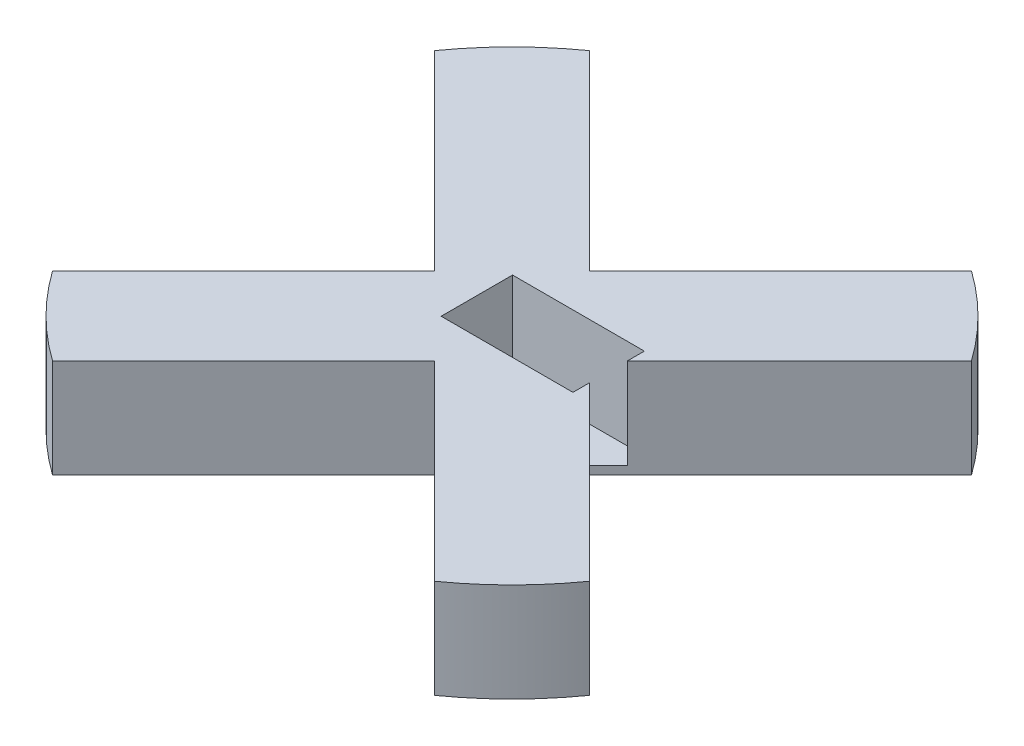
ISO-10303-21;
HEADER;
FILE_DESCRIPTION(('STEP AP214'),'2;1');
FILE_NAME('part.step','',(''),(''),'','','');
FILE_SCHEMA(('AUTOMOTIVE_DESIGN { 1 0 10303 214 1 1 1 1 }'));
ENDSEC;
DATA;
#1=APPLICATION_CONTEXT('core data for automotive mechanical design processes');
#2=APPLICATION_PROTOCOL_DEFINITION('international standard','automotive_design',2000,#1);
#3=PRODUCT_CONTEXT('',#1,'mechanical');
#4=PRODUCT('Part','Part','',(#3));
#5=PRODUCT_RELATED_PRODUCT_CATEGORY('part','',(#4));
#6=PRODUCT_DEFINITION_FORMATION('','',#4);
#7=PRODUCT_DEFINITION_CONTEXT('part definition',#1,'design');
#8=PRODUCT_DEFINITION('design','',#6,#7);
#9=PRODUCT_DEFINITION_SHAPE('','',#8);
#10=(LENGTH_UNIT() NAMED_UNIT(*) SI_UNIT(.MILLI.,.METRE.));
#11=(NAMED_UNIT(*) PLANE_ANGLE_UNIT() SI_UNIT($,.RADIAN.));
#12=(NAMED_UNIT(*) SI_UNIT($,.STERADIAN.) SOLID_ANGLE_UNIT());
#13=UNCERTAINTY_MEASURE_WITH_UNIT(LENGTH_MEASURE(1.E-05),#10,'distance_accuracy_value','');
#14=(GEOMETRIC_REPRESENTATION_CONTEXT(3) GLOBAL_UNCERTAINTY_ASSIGNED_CONTEXT((#13)) GLOBAL_UNIT_ASSIGNED_CONTEXT((#10,
#11,#12)) REPRESENTATION_CONTEXT('',''));
#15=CARTESIAN_POINT('',(0.,0.,0.));
#16=DIRECTION('',(0.,0.,1.));
#17=DIRECTION('',(1.,0.,0.));
#18=AXIS2_PLACEMENT_3D('',#15,#16,#17);
#19=CARTESIAN_POINT('',(0.,18.,0.));
#20=DIRECTION('',(0.,-1.,0.));
#21=DIRECTION('',(0.,0.,-1.));
#22=AXIS2_PLACEMENT_3D('',#19,#20,#21);
#23=CYLINDRICAL_SURFACE('',#22,60.);
#24=CARTESIAN_POINT('',(0.,0.,0.));
#25=DIRECTION('',(0.,1.,0.));
#26=DIRECTION('',(0.,0.,1.));
#27=AXIS2_PLACEMENT_3D('',#24,#25,#26);
#28=CIRCLE('',#27,60.);
#29=CARTESIAN_POINT('',(-34.7619335148383,0.,-48.9040691385692));
#30=VERTEX_POINT('',#29);
#31=CARTESIAN_POINT('',(-48.9040691385692,0.,-34.7619335148383));
#32=VERTEX_POINT('',#31);
#33=EDGE_CURVE('E163',#30,#32,#28,.T.);
#34=ORIENTED_EDGE('',*,*,#33,.T.);
#35=DIRECTION('',(0.,-1.,0.));
#36=VECTOR('',#35,1.);
#37=CARTESIAN_POINT('',(-48.9040691385692,18.,-34.7619335148383));
#38=LINE('',#37,#36);
#39=CARTESIAN_POINT('',(-48.9040691385692,18.,-34.7619335148383));
#40=VERTEX_POINT('',#39);
#41=EDGE_CURVE('E212',#40,#32,#38,.T.);
#42=ORIENTED_EDGE('',*,*,#41,.F.);
#43=CARTESIAN_POINT('',(0.,18.,0.));
#44=DIRECTION('',(0.,1.,0.));
#45=DIRECTION('',(0.,0.,1.));
#46=AXIS2_PLACEMENT_3D('',#43,#44,#45);
#47=CIRCLE('',#46,60.);
#48=CARTESIAN_POINT('',(-34.7619335148383,18.,-48.9040691385692));
#49=VERTEX_POINT('',#48);
#50=EDGE_CURVE('E188',#49,#40,#47,.T.);
#51=ORIENTED_EDGE('',*,*,#50,.F.);
#52=DIRECTION('',(0.,-1.,0.));
#53=VECTOR('',#52,1.);
#54=CARTESIAN_POINT('',(-34.7619335148383,18.,-48.9040691385692));
#55=LINE('',#54,#53);
#56=EDGE_CURVE('E159',#49,#30,#55,.T.);
#57=ORIENTED_EDGE('',*,*,#56,.T.);
#58=EDGE_LOOP('',(#34,#42,#51,#57));
#59=FACE_BOUND('',#58,.T.);
#60=ADVANCED_FACE('F33',(#59),#23,.T.);
#61=CARTESIAN_POINT('',(-14.1421356237309,18.,0.));
#62=DIRECTION('',(0.707106781186548,0.,-0.707106781186547));
#63=DIRECTION('',(-0.707106781186547,0.,-0.707106781186548));
#64=AXIS2_PLACEMENT_3D('',#61,#62,#63);
#65=PLANE('',#64);
#66=DIRECTION('',(0.707106781186547,0.,0.707106781186548));
#67=VECTOR('',#66,1.);
#68=CARTESIAN_POINT('',(-14.1421356237309,0.,0.));
#69=LINE('',#68,#67);
#70=CARTESIAN_POINT('',(-14.1421356237309,0.,0.));
#71=VERTEX_POINT('',#70);
#72=EDGE_CURVE('E166',#32,#71,#69,.T.);
#73=ORIENTED_EDGE('',*,*,#72,.T.);
#74=DIRECTION('',(0.,-1.,0.));
#75=VECTOR('',#74,1.);
#76=CARTESIAN_POINT('',(-14.1421356237309,18.,0.));
#77=LINE('',#76,#75);
#78=CARTESIAN_POINT('',(-14.1421356237309,18.,0.));
#79=VERTEX_POINT('',#78);
#80=EDGE_CURVE('E209',#79,#71,#77,.T.);
#81=ORIENTED_EDGE('',*,*,#80,.F.);
#82=DIRECTION('',(0.707106781186547,0.,0.707106781186548));
#83=VECTOR('',#82,1.);
#84=CARTESIAN_POINT('',(-14.1421356237309,18.,0.));
#85=LINE('',#84,#83);
#86=EDGE_CURVE('E110',#40,#79,#85,.T.);
#87=ORIENTED_EDGE('',*,*,#86,.F.);
#88=ORIENTED_EDGE('',*,*,#41,.T.);
#89=EDGE_LOOP('',(#73,#81,#87,#88));
#90=FACE_BOUND('',#89,.T.);
#91=ADVANCED_FACE('F333',(#90),#65,.F.);
#92=CARTESIAN_POINT('',(-14.1421356237309,18.,0.));
#93=DIRECTION('',(0.707106781186548,0.,0.707106781186547));
#94=DIRECTION('',(0.707106781186547,0.,-0.707106781186548));
#95=AXIS2_PLACEMENT_3D('',#92,#93,#94);
#96=PLANE('',#95);
#97=DIRECTION('',(-0.707106781186547,0.,0.707106781186548));
#98=VECTOR('',#97,1.);
#99=CARTESIAN_POINT('',(-14.1421356237309,0.,0.));
#100=LINE('',#99,#98);
#101=CARTESIAN_POINT('',(-48.9040691385693,0.,34.7619335148383));
#102=VERTEX_POINT('',#101);
#103=EDGE_CURVE('E169',#71,#102,#100,.T.);
#104=ORIENTED_EDGE('',*,*,#103,.T.);
#105=DIRECTION('',(0.,-1.,0.));
#106=VECTOR('',#105,1.);
#107=CARTESIAN_POINT('',(-48.9040691385693,18.,34.7619335148383));
#108=LINE('',#107,#106);
#109=CARTESIAN_POINT('',(-48.9040691385693,18.,34.7619335148383));
#110=VERTEX_POINT('',#109);
#111=EDGE_CURVE('E206',#110,#102,#108,.T.);
#112=ORIENTED_EDGE('',*,*,#111,.F.);
#113=DIRECTION('',(-0.707106781186547,0.,0.707106781186548));
#114=VECTOR('',#113,1.);
#115=CARTESIAN_POINT('',(-14.1421356237309,18.,0.));
#116=LINE('',#115,#114);
#117=EDGE_CURVE('E266',#79,#110,#116,.T.);
#118=ORIENTED_EDGE('',*,*,#117,.F.);
#119=ORIENTED_EDGE('',*,*,#80,.T.);
#120=EDGE_LOOP('',(#104,#112,#118,#119));
#121=FACE_BOUND('',#120,.T.);
#122=ADVANCED_FACE('F336',(#121),#96,.F.);
#123=CARTESIAN_POINT('',(0.,18.,0.));
#124=DIRECTION('',(0.,-1.,0.));
#125=DIRECTION('',(0.,0.,-1.));
#126=AXIS2_PLACEMENT_3D('',#123,#124,#125);
#127=CYLINDRICAL_SURFACE('',#126,60.);
#128=CARTESIAN_POINT('',(0.,0.,0.));
#129=DIRECTION('',(0.,1.,0.));
#130=DIRECTION('',(0.,0.,-1.));
#131=AXIS2_PLACEMENT_3D('',#128,#129,#130);
#132=CIRCLE('',#131,60.);
#133=CARTESIAN_POINT('',(-34.7619335148383,0.,48.9040691385692));
#134=VERTEX_POINT('',#133);
#135=EDGE_CURVE('E171',#102,#134,#132,.T.);
#136=ORIENTED_EDGE('',*,*,#135,.T.);
#137=DIRECTION('',(0.,-1.,0.));
#138=VECTOR('',#137,1.);
#139=CARTESIAN_POINT('',(-34.7619335148383,18.,48.9040691385692));
#140=LINE('',#139,#138);
#141=CARTESIAN_POINT('',(-34.7619335148383,18.,48.9040691385692));
#142=VERTEX_POINT('',#141);
#143=EDGE_CURVE('E203',#142,#134,#140,.T.);
#144=ORIENTED_EDGE('',*,*,#143,.F.);
#145=CARTESIAN_POINT('',(0.,18.,0.));
#146=DIRECTION('',(0.,1.,0.));
#147=DIRECTION('',(0.,0.,-1.));
#148=AXIS2_PLACEMENT_3D('',#145,#146,#147);
#149=CIRCLE('',#148,60.);
#150=EDGE_CURVE('E268',#110,#142,#149,.T.);
#151=ORIENTED_EDGE('',*,*,#150,.F.);
#152=ORIENTED_EDGE('',*,*,#111,.T.);
#153=EDGE_LOOP('',(#136,#144,#151,#152));
#154=FACE_BOUND('',#153,.T.);
#155=ADVANCED_FACE('F341',(#154),#127,.T.);
#156=CARTESIAN_POINT('',(0.,18.,14.142135623731));
#157=DIRECTION('',(-0.707106781186548,0.,-0.707106781186548));
#158=DIRECTION('',(-0.707106781186548,0.,0.707106781186547));
#159=AXIS2_PLACEMENT_3D('',#156,#157,#158);
#160=PLANE('',#159);
#161=DIRECTION('',(0.707106781186547,0.,-0.707106781186547));
#162=VECTOR('',#161,1.);
#163=CARTESIAN_POINT('',(0.,0.,14.142135623731));
#164=LINE('',#163,#162);
#165=CARTESIAN_POINT('',(0.,0.,14.142135623731));
#166=VERTEX_POINT('',#165);
#167=EDGE_CURVE('E173',#134,#166,#164,.T.);
#168=ORIENTED_EDGE('',*,*,#167,.T.);
#169=DIRECTION('',(0.,-1.,0.));
#170=VECTOR('',#169,1.);
#171=CARTESIAN_POINT('',(0.,18.,14.142135623731));
#172=LINE('',#171,#170);
#173=CARTESIAN_POINT('',(0.,18.,14.142135623731));
#174=VERTEX_POINT('',#173);
#175=EDGE_CURVE('E200',#174,#166,#172,.T.);
#176=ORIENTED_EDGE('',*,*,#175,.F.);
#177=DIRECTION('',(0.707106781186547,0.,-0.707106781186547));
#178=VECTOR('',#177,1.);
#179=CARTESIAN_POINT('',(0.,18.,14.142135623731));
#180=LINE('',#179,#178);
#181=EDGE_CURVE('E270',#142,#174,#180,.T.);
#182=ORIENTED_EDGE('',*,*,#181,.F.);
#183=ORIENTED_EDGE('',*,*,#143,.T.);
#184=EDGE_LOOP('',(#168,#176,#182,#183));
#185=FACE_BOUND('',#184,.T.);
#186=ADVANCED_FACE('F347',(#185),#160,.F.);
#187=CARTESIAN_POINT('',(0.,18.,14.142135623731));
#188=DIRECTION('',(0.707106781186548,0.,-0.707106781186548));
#189=DIRECTION('',(-0.707106781186548,0.,-0.707106781186547));
#190=AXIS2_PLACEMENT_3D('',#187,#188,#189);
#191=PLANE('',#190);
#192=DIRECTION('',(0.707106781186547,0.,0.707106781186547));
#193=VECTOR('',#192,1.);
#194=CARTESIAN_POINT('',(0.,0.,14.142135623731));
#195=LINE('',#194,#193);
#196=CARTESIAN_POINT('',(34.7619335148383,0.,48.9040691385692));
#197=VERTEX_POINT('',#196);
#198=EDGE_CURVE('E175',#166,#197,#195,.T.);
#199=ORIENTED_EDGE('',*,*,#198,.T.);
#200=DIRECTION('',(0.,-1.,0.));
#201=VECTOR('',#200,1.);
#202=CARTESIAN_POINT('',(34.7619335148383,18.,48.9040691385692));
#203=LINE('',#202,#201);
#204=CARTESIAN_POINT('',(34.7619335148383,18.,48.9040691385692));
#205=VERTEX_POINT('',#204);
#206=EDGE_CURVE('E197',#205,#197,#203,.T.);
#207=ORIENTED_EDGE('',*,*,#206,.F.);
#208=DIRECTION('',(0.707106781186547,0.,0.707106781186547));
#209=VECTOR('',#208,1.);
#210=CARTESIAN_POINT('',(0.,18.,14.142135623731));
#211=LINE('',#210,#209);
#212=EDGE_CURVE('E272',#174,#205,#211,.T.);
#213=ORIENTED_EDGE('',*,*,#212,.F.);
#214=ORIENTED_EDGE('',*,*,#175,.T.);
#215=EDGE_LOOP('',(#199,#207,#213,#214));
#216=FACE_BOUND('',#215,.T.);
#217=ADVANCED_FACE('F351',(#216),#191,.F.);
#218=CARTESIAN_POINT('',(0.,18.,0.));
#219=DIRECTION('',(0.,-1.,0.));
#220=DIRECTION('',(0.,0.,-1.));
#221=AXIS2_PLACEMENT_3D('',#218,#219,#220);
#222=CYLINDRICAL_SURFACE('',#221,60.);
#223=CARTESIAN_POINT('',(0.,0.,0.));
#224=DIRECTION('',(0.,1.,0.));
#225=DIRECTION('',(0.,0.,1.));
#226=AXIS2_PLACEMENT_3D('',#223,#224,#225);
#227=CIRCLE('',#226,60.);
#228=CARTESIAN_POINT('',(48.9040691385692,0.,34.7619335148383));
#229=VERTEX_POINT('',#228);
#230=EDGE_CURVE('E177',#197,#229,#227,.T.);
#231=ORIENTED_EDGE('',*,*,#230,.T.);
#232=DIRECTION('',(0.,-1.,0.));
#233=VECTOR('',#232,1.);
#234=CARTESIAN_POINT('',(48.9040691385692,18.,34.7619335148383));
#235=LINE('',#234,#233);
#236=CARTESIAN_POINT('',(48.9040691385692,18.,34.7619335148383));
#237=VERTEX_POINT('',#236);
#238=EDGE_CURVE('E194',#237,#229,#235,.T.);
#239=ORIENTED_EDGE('',*,*,#238,.F.);
#240=CARTESIAN_POINT('',(0.,18.,0.));
#241=DIRECTION('',(0.,1.,0.));
#242=DIRECTION('',(0.,0.,1.));
#243=AXIS2_PLACEMENT_3D('',#240,#241,#242);
#244=CIRCLE('',#243,60.);
#245=EDGE_CURVE('E274',#205,#237,#244,.T.);
#246=ORIENTED_EDGE('',*,*,#245,.F.);
#247=ORIENTED_EDGE('',*,*,#206,.T.);
#248=EDGE_LOOP('',(#231,#239,#246,#247));
#249=FACE_BOUND('',#248,.T.);
#250=ADVANCED_FACE('F354',(#249),#222,.T.);
#251=CARTESIAN_POINT('',(14.1421356237309,18.,0.));
#252=DIRECTION('',(-0.707106781186548,0.,0.707106781186547));
#253=DIRECTION('',(0.707106781186547,0.,0.707106781186548));
#254=AXIS2_PLACEMENT_3D('',#251,#252,#253);
#255=PLANE('',#254);
#256=DIRECTION('',(-0.707106781186547,0.,-0.707106781186548));
#257=VECTOR('',#256,1.);
#258=CARTESIAN_POINT('',(14.1421356237309,1.5,0.));
#259=LINE('',#258,#257);
#260=CARTESIAN_POINT('',(17.6,1.5,3.45786437626905));
#261=VERTEX_POINT('',#260);
#262=CARTESIAN_POINT('',(14.1421356237309,1.5,0.));
#263=VERTEX_POINT('',#262);
#264=EDGE_CURVE('E167',#261,#263,#259,.T.);
#265=ORIENTED_EDGE('',*,*,#264,.F.);
#266=DIRECTION('',(0.,1.,0.));
#267=VECTOR('',#266,1.);
#268=CARTESIAN_POINT('',(17.6,18.,3.45786437626905));
#269=LINE('',#268,#267);
#270=CARTESIAN_POINT('',(17.6,18.,3.45786437626905));
#271=VERTEX_POINT('',#270);
#272=EDGE_CURVE('E259',#261,#271,#269,.T.);
#273=ORIENTED_EDGE('',*,*,#272,.T.);
#274=DIRECTION('',(-0.707106781186547,0.,-0.707106781186548));
#275=VECTOR('',#274,1.);
#276=CARTESIAN_POINT('',(14.1421356237309,18.,0.));
#277=LINE('',#276,#275);
#278=EDGE_CURVE('E276',#237,#271,#277,.T.);
#279=ORIENTED_EDGE('',*,*,#278,.F.);
#280=ORIENTED_EDGE('',*,*,#238,.T.);
#281=DIRECTION('',(-0.707106781186547,0.,-0.707106781186548));
#282=VECTOR('',#281,1.);
#283=CARTESIAN_POINT('',(14.1421356237309,0.,0.));
#284=LINE('',#283,#282);
#285=CARTESIAN_POINT('',(14.1421356237309,0.,0.));
#286=VERTEX_POINT('',#285);
#287=EDGE_CURVE('E179',#229,#286,#284,.T.);
#288=ORIENTED_EDGE('',*,*,#287,.T.);
#289=DIRECTION('',(0.,-1.,0.));
#290=VECTOR('',#289,1.);
#291=CARTESIAN_POINT('',(14.1421356237309,18.,0.));
#292=LINE('',#291,#290);
#293=EDGE_CURVE('E192',#263,#286,#292,.T.);
#294=ORIENTED_EDGE('',*,*,#293,.F.);
#295=EDGE_LOOP('',(#265,#273,#279,#280,#288,#294));
#296=FACE_BOUND('',#295,.T.);
#297=ADVANCED_FACE('F287',(#296),#255,.F.);
#298=CARTESIAN_POINT('',(14.1421356237309,18.,0.));
#299=DIRECTION('',(-0.707106781186548,0.,-0.707106781186547));
#300=DIRECTION('',(-0.707106781186547,0.,0.707106781186548));
#301=AXIS2_PLACEMENT_3D('',#298,#299,#300);
#302=PLANE('',#301);
#303=DIRECTION('',(0.707106781186547,0.,-0.707106781186548));
#304=VECTOR('',#303,1.);
#305=CARTESIAN_POINT('',(14.1421356237309,18.,0.));
#306=LINE('',#305,#304);
#307=CARTESIAN_POINT('',(17.6,18.,-3.45786437626905));
#308=VERTEX_POINT('',#307);
#309=CARTESIAN_POINT('',(48.9040691385692,18.,-34.7619335148383));
#310=VERTEX_POINT('',#309);
#311=EDGE_CURVE('E142',#308,#310,#306,.T.);
#312=ORIENTED_EDGE('',*,*,#311,.F.);
#313=DIRECTION('',(0.,-1.,0.));
#314=VECTOR('',#313,1.);
#315=CARTESIAN_POINT('',(17.6,18.,-3.45786437626905));
#316=LINE('',#315,#314);
#317=CARTESIAN_POINT('',(17.6,1.5,-3.45786437626905));
#318=VERTEX_POINT('',#317);
#319=EDGE_CURVE('E226',#308,#318,#316,.T.);
#320=ORIENTED_EDGE('',*,*,#319,.T.);
#321=DIRECTION('',(0.707106781186547,0.,-0.707106781186548));
#322=VECTOR('',#321,1.);
#323=CARTESIAN_POINT('',(14.1421356237309,1.5,0.));
#324=LINE('',#323,#322);
#325=EDGE_CURVE('E11',#263,#318,#324,.T.);
#326=ORIENTED_EDGE('',*,*,#325,.F.);
#327=ORIENTED_EDGE('',*,*,#293,.T.);
#328=DIRECTION('',(0.707106781186547,0.,-0.707106781186548));
#329=VECTOR('',#328,1.);
#330=CARTESIAN_POINT('',(14.1421356237309,0.,0.));
#331=LINE('',#330,#329);
#332=CARTESIAN_POINT('',(48.9040691385692,0.,-34.7619335148383));
#333=VERTEX_POINT('',#332);
#334=EDGE_CURVE('E182',#286,#333,#331,.T.);
#335=ORIENTED_EDGE('',*,*,#334,.T.);
#336=DIRECTION('',(0.,-1.,0.));
#337=VECTOR('',#336,1.);
#338=CARTESIAN_POINT('',(48.9040691385692,18.,-34.7619335148383));
#339=LINE('',#338,#337);
#340=EDGE_CURVE('E154',#310,#333,#339,.T.);
#341=ORIENTED_EDGE('',*,*,#340,.F.);
#342=EDGE_LOOP('',(#312,#320,#326,#327,#335,#341));
#343=FACE_BOUND('',#342,.T.);
#344=ADVANCED_FACE('F322',(#343),#302,.F.);
#345=CARTESIAN_POINT('',(0.,18.,0.));
#346=DIRECTION('',(0.,-1.,0.));
#347=DIRECTION('',(0.,0.,-1.));
#348=AXIS2_PLACEMENT_3D('',#345,#346,#347);
#349=CYLINDRICAL_SURFACE('',#348,60.);
#350=CARTESIAN_POINT('',(0.,0.,0.));
#351=DIRECTION('',(0.,1.,0.));
#352=DIRECTION('',(0.,0.,-1.));
#353=AXIS2_PLACEMENT_3D('',#350,#351,#352);
#354=CIRCLE('',#353,60.);
#355=CARTESIAN_POINT('',(34.7619335148383,0.,-48.9040691385692));
#356=VERTEX_POINT('',#355);
#357=EDGE_CURVE('E151',#333,#356,#354,.T.);
#358=ORIENTED_EDGE('',*,*,#357,.T.);
#359=DIRECTION('',(0.,-1.,0.));
#360=VECTOR('',#359,1.);
#361=CARTESIAN_POINT('',(34.7619335148383,18.,-48.9040691385692));
#362=LINE('',#361,#360);
#363=CARTESIAN_POINT('',(34.7619335148383,18.,-48.9040691385692));
#364=VERTEX_POINT('',#363);
#365=EDGE_CURVE('E148',#364,#356,#362,.T.);
#366=ORIENTED_EDGE('',*,*,#365,.F.);
#367=CARTESIAN_POINT('',(0.,18.,0.));
#368=DIRECTION('',(0.,1.,0.));
#369=DIRECTION('',(0.,0.,-1.));
#370=AXIS2_PLACEMENT_3D('',#367,#368,#369);
#371=CIRCLE('',#370,60.);
#372=EDGE_CURVE('E134',#310,#364,#371,.T.);
#373=ORIENTED_EDGE('',*,*,#372,.F.);
#374=ORIENTED_EDGE('',*,*,#340,.T.);
#375=EDGE_LOOP('',(#358,#366,#373,#374));
#376=FACE_BOUND('',#375,.T.);
#377=ADVANCED_FACE('F149',(#376),#349,.T.);
#378=CARTESIAN_POINT('',(0.,18.,-14.1421356237309));
#379=DIRECTION('',(0.707106781186547,0.,0.707106781186547));
#380=DIRECTION('',(0.707106781186548,0.,-0.707106781186548));
#381=AXIS2_PLACEMENT_3D('',#378,#379,#380);
#382=PLANE('',#381);
#383=DIRECTION('',(-0.707106781186547,0.,0.707106781186547));
#384=VECTOR('',#383,1.);
#385=CARTESIAN_POINT('',(0.,0.,-14.1421356237309));
#386=LINE('',#385,#384);
#387=CARTESIAN_POINT('',(0.,0.,-14.1421356237309));
#388=VERTEX_POINT('',#387);
#389=EDGE_CURVE('E185',#356,#388,#386,.T.);
#390=ORIENTED_EDGE('',*,*,#389,.T.);
#391=DIRECTION('',(0.,-1.,0.));
#392=VECTOR('',#391,1.);
#393=CARTESIAN_POINT('',(0.,18.,-14.1421356237309));
#394=LINE('',#393,#392);
#395=CARTESIAN_POINT('',(0.,18.,-14.1421356237309));
#396=VERTEX_POINT('',#395);
#397=EDGE_CURVE('E155',#396,#388,#394,.T.);
#398=ORIENTED_EDGE('',*,*,#397,.F.);
#399=DIRECTION('',(-0.707106781186547,0.,0.707106781186547));
#400=VECTOR('',#399,1.);
#401=CARTESIAN_POINT('',(0.,18.,-14.1421356237309));
#402=LINE('',#401,#400);
#403=EDGE_CURVE('E139',#364,#396,#402,.T.);
#404=ORIENTED_EDGE('',*,*,#403,.F.);
#405=ORIENTED_EDGE('',*,*,#365,.T.);
#406=EDGE_LOOP('',(#390,#398,#404,#405));
#407=FACE_BOUND('',#406,.T.);
#408=ADVANCED_FACE('F157',(#407),#382,.F.);
#409=CARTESIAN_POINT('',(0.,18.,-14.1421356237309));
#410=DIRECTION('',(-0.707106781186547,0.,0.707106781186547));
#411=DIRECTION('',(0.707106781186548,0.,0.707106781186548));
#412=AXIS2_PLACEMENT_3D('',#409,#410,#411);
#413=PLANE('',#412);
#414=DIRECTION('',(-0.707106781186547,0.,-0.707106781186547));
#415=VECTOR('',#414,1.);
#416=CARTESIAN_POINT('',(0.,0.,-14.1421356237309));
#417=LINE('',#416,#415);
#418=EDGE_CURVE('E101',#388,#30,#417,.T.);
#419=ORIENTED_EDGE('',*,*,#418,.T.);
#420=ORIENTED_EDGE('',*,*,#56,.F.);
#421=DIRECTION('',(-0.707106781186547,0.,-0.707106781186547));
#422=VECTOR('',#421,1.);
#423=CARTESIAN_POINT('',(0.,18.,-14.1421356237309));
#424=LINE('',#423,#422);
#425=EDGE_CURVE('E56',#396,#49,#424,.T.);
#426=ORIENTED_EDGE('',*,*,#425,.F.);
#427=ORIENTED_EDGE('',*,*,#397,.T.);
#428=EDGE_LOOP('',(#419,#420,#426,#427));
#429=FACE_BOUND('',#428,.T.);
#430=ADVANCED_FACE('F327',(#429),#413,.F.);
#431=CARTESIAN_POINT('',(0.,18.,0.));
#432=DIRECTION('',(0.,1.,0.));
#433=DIRECTION('',(0.,0.,1.));
#434=AXIS2_PLACEMENT_3D('',#431,#432,#433);
#435=PLANE('',#434);
#436=DIRECTION('',(0.,0.,-1.));
#437=VECTOR('',#436,1.);
#438=CARTESIAN_POINT('',(17.6,18.,0.));
#439=LINE('',#438,#437);
#440=CARTESIAN_POINT('',(17.6,18.,-6.5));
#441=VERTEX_POINT('',#440);
#442=EDGE_CURVE('E40',#308,#441,#439,.T.);
#443=ORIENTED_EDGE('',*,*,#442,.F.);
#444=ORIENTED_EDGE('',*,*,#311,.T.);
#445=ORIENTED_EDGE('',*,*,#372,.T.);
#446=ORIENTED_EDGE('',*,*,#403,.T.);
#447=ORIENTED_EDGE('',*,*,#425,.T.);
#448=ORIENTED_EDGE('',*,*,#50,.T.);
#449=ORIENTED_EDGE('',*,*,#86,.T.);
#450=ORIENTED_EDGE('',*,*,#117,.T.);
#451=ORIENTED_EDGE('',*,*,#150,.T.);
#452=ORIENTED_EDGE('',*,*,#181,.T.);
#453=ORIENTED_EDGE('',*,*,#212,.T.);
#454=ORIENTED_EDGE('',*,*,#245,.T.);
#455=ORIENTED_EDGE('',*,*,#278,.T.);
#456=DIRECTION('',(0.,0.,-1.));
#457=VECTOR('',#456,1.);
#458=CARTESIAN_POINT('',(17.6,18.,6.5));
#459=LINE('',#458,#457);
#460=CARTESIAN_POINT('',(17.6,18.,6.5));
#461=VERTEX_POINT('',#460);
#462=EDGE_CURVE('E243',#461,#271,#459,.T.);
#463=ORIENTED_EDGE('',*,*,#462,.F.);
#464=DIRECTION('',(1.,0.,0.));
#465=VECTOR('',#464,1.);
#466=CARTESIAN_POINT('',(17.6,18.,6.5));
#467=LINE('',#466,#465);
#468=CARTESIAN_POINT('',(-6.4,18.,6.5));
#469=VERTEX_POINT('',#468);
#470=EDGE_CURVE('E249',#469,#461,#467,.T.);
#471=ORIENTED_EDGE('',*,*,#470,.F.);
#472=DIRECTION('',(0.,0.,1.));
#473=VECTOR('',#472,1.);
#474=CARTESIAN_POINT('',(-6.4,18.,6.5));
#475=LINE('',#474,#473);
#476=CARTESIAN_POINT('',(-6.4,18.,-6.5));
#477=VERTEX_POINT('',#476);
#478=EDGE_CURVE('E47',#477,#469,#475,.T.);
#479=ORIENTED_EDGE('',*,*,#478,.F.);
#480=DIRECTION('',(-1.,0.,0.));
#481=VECTOR('',#480,1.);
#482=CARTESIAN_POINT('',(17.6,18.,-6.5));
#483=LINE('',#482,#481);
#484=EDGE_CURVE('E235',#441,#477,#483,.T.);
#485=ORIENTED_EDGE('',*,*,#484,.F.);
#486=EDGE_LOOP('',(#443,#444,#445,#446,#447,#448,#449,#450,#451,#452,#453,#454,#455,#463,#471,
#479,#485));
#487=FACE_BOUND('',#486,.T.);
#488=ADVANCED_FACE('F137',(#487),#435,.T.);
#489=CARTESIAN_POINT('',(0.,0.,0.));
#490=DIRECTION('',(0.,1.,0.));
#491=DIRECTION('',(0.,0.,1.));
#492=AXIS2_PLACEMENT_3D('',#489,#490,#491);
#493=PLANE('',#492);
#494=ORIENTED_EDGE('',*,*,#33,.F.);
#495=ORIENTED_EDGE('',*,*,#418,.F.);
#496=ORIENTED_EDGE('',*,*,#389,.F.);
#497=ORIENTED_EDGE('',*,*,#357,.F.);
#498=ORIENTED_EDGE('',*,*,#334,.F.);
#499=ORIENTED_EDGE('',*,*,#287,.F.);
#500=ORIENTED_EDGE('',*,*,#230,.F.);
#501=ORIENTED_EDGE('',*,*,#198,.F.);
#502=ORIENTED_EDGE('',*,*,#167,.F.);
#503=ORIENTED_EDGE('',*,*,#135,.F.);
#504=ORIENTED_EDGE('',*,*,#103,.F.);
#505=ORIENTED_EDGE('',*,*,#72,.F.);
#506=EDGE_LOOP('',(#494,#495,#496,#497,#498,#499,#500,#501,#502,#503,#504,#505));
#507=FACE_BOUND('',#506,.T.);
#508=ADVANCED_FACE('F326',(#507),#493,.F.);
#509=CARTESIAN_POINT('',(0.,1.5,0.));
#510=DIRECTION('',(0.,1.,0.));
#511=DIRECTION('',(0.,0.,1.));
#512=AXIS2_PLACEMENT_3D('',#509,#510,#511);
#513=PLANE('',#512);
#514=ORIENTED_EDGE('',*,*,#264,.T.);
#515=ORIENTED_EDGE('',*,*,#325,.T.);
#516=DIRECTION('',(0.,0.,-1.));
#517=VECTOR('',#516,1.);
#518=CARTESIAN_POINT('',(17.6,1.5,6.5));
#519=LINE('',#518,#517);
#520=CARTESIAN_POINT('',(17.6,1.5,-6.5));
#521=VERTEX_POINT('',#520);
#522=EDGE_CURVE('E305',#318,#521,#519,.T.);
#523=ORIENTED_EDGE('',*,*,#522,.T.);
#524=DIRECTION('',(-1.,0.,0.));
#525=VECTOR('',#524,1.);
#526=CARTESIAN_POINT('',(17.6,1.5,-6.5));
#527=LINE('',#526,#525);
#528=CARTESIAN_POINT('',(-6.4,1.5,-6.5));
#529=VERTEX_POINT('',#528);
#530=EDGE_CURVE('E237',#521,#529,#527,.T.);
#531=ORIENTED_EDGE('',*,*,#530,.T.);
#532=DIRECTION('',(0.,0.,1.));
#533=VECTOR('',#532,1.);
#534=CARTESIAN_POINT('',(-6.4,1.5,6.5));
#535=LINE('',#534,#533);
#536=CARTESIAN_POINT('',(-6.4,1.5,6.5));
#537=VERTEX_POINT('',#536);
#538=EDGE_CURVE('E242',#529,#537,#535,.T.);
#539=ORIENTED_EDGE('',*,*,#538,.T.);
#540=DIRECTION('',(1.,0.,0.));
#541=VECTOR('',#540,1.);
#542=CARTESIAN_POINT('',(17.6,1.5,6.5));
#543=LINE('',#542,#541);
#544=CARTESIAN_POINT('',(17.6,1.5,6.5));
#545=VERTEX_POINT('',#544);
#546=EDGE_CURVE('E246',#537,#545,#543,.T.);
#547=ORIENTED_EDGE('',*,*,#546,.T.);
#548=EDGE_CURVE('E297',#545,#261,#519,.T.);
#549=ORIENTED_EDGE('',*,*,#548,.T.);
#550=EDGE_LOOP('',(#514,#515,#523,#531,#539,#547,#549));
#551=FACE_BOUND('',#550,.T.);
#552=ADVANCED_FACE('F302',(#551),#513,.T.);
#553=CARTESIAN_POINT('',(17.6,1.5,6.5));
#554=DIRECTION('',(1.,0.,0.));
#555=DIRECTION('',(0.,0.,-1.));
#556=AXIS2_PLACEMENT_3D('',#553,#554,#555);
#557=PLANE('',#556);
#558=ORIENTED_EDGE('',*,*,#548,.F.);
#559=DIRECTION('',(0.,1.,0.));
#560=VECTOR('',#559,1.);
#561=CARTESIAN_POINT('',(17.6,1.5,6.5));
#562=LINE('',#561,#560);
#563=EDGE_CURVE('E239',#545,#461,#562,.T.);
#564=ORIENTED_EDGE('',*,*,#563,.T.);
#565=ORIENTED_EDGE('',*,*,#462,.T.);
#566=ORIENTED_EDGE('',*,*,#272,.F.);
#567=EDGE_LOOP('',(#558,#564,#565,#566));
#568=FACE_BOUND('',#567,.T.);
#569=ADVANCED_FACE('F295',(#568),#557,.F.);
#570=ORIENTED_EDGE('',*,*,#442,.T.);
#571=DIRECTION('',(0.,1.,0.));
#572=VECTOR('',#571,1.);
#573=CARTESIAN_POINT('',(17.6,1.5,-6.5));
#574=LINE('',#573,#572);
#575=EDGE_CURVE('E222',#521,#441,#574,.T.);
#576=ORIENTED_EDGE('',*,*,#575,.F.);
#577=ORIENTED_EDGE('',*,*,#522,.F.);
#578=ORIENTED_EDGE('',*,*,#319,.F.);
#579=EDGE_LOOP('',(#570,#576,#577,#578));
#580=FACE_BOUND('',#579,.T.);
#581=ADVANCED_FACE('F219',(#580),#557,.F.);
#582=CARTESIAN_POINT('',(-6.4,1.5,6.5));
#583=DIRECTION('',(-1.,0.,0.));
#584=DIRECTION('',(0.,0.,1.));
#585=AXIS2_PLACEMENT_3D('',#582,#583,#584);
#586=PLANE('',#585);
#587=ORIENTED_EDGE('',*,*,#478,.T.);
#588=DIRECTION('',(0.,1.,0.));
#589=VECTOR('',#588,1.);
#590=CARTESIAN_POINT('',(-6.4,1.5,6.5));
#591=LINE('',#590,#589);
#592=EDGE_CURVE('E256',#537,#469,#591,.T.);
#593=ORIENTED_EDGE('',*,*,#592,.F.);
#594=ORIENTED_EDGE('',*,*,#538,.F.);
#595=DIRECTION('',(0.,1.,0.));
#596=VECTOR('',#595,1.);
#597=CARTESIAN_POINT('',(-6.4,1.5,-6.5));
#598=LINE('',#597,#596);
#599=EDGE_CURVE('E238',#529,#477,#598,.T.);
#600=ORIENTED_EDGE('',*,*,#599,.T.);
#601=EDGE_LOOP('',(#587,#593,#594,#600));
#602=FACE_BOUND('',#601,.T.);
#603=ADVANCED_FACE('F466',(#602),#586,.F.);
#604=CARTESIAN_POINT('',(17.6,1.5,-6.5));
#605=DIRECTION('',(0.,0.,-1.));
#606=DIRECTION('',(-1.,0.,0.));
#607=AXIS2_PLACEMENT_3D('',#604,#605,#606);
#608=PLANE('',#607);
#609=ORIENTED_EDGE('',*,*,#484,.T.);
#610=ORIENTED_EDGE('',*,*,#599,.F.);
#611=ORIENTED_EDGE('',*,*,#530,.F.);
#612=ORIENTED_EDGE('',*,*,#575,.T.);
#613=EDGE_LOOP('',(#609,#610,#611,#612));
#614=FACE_BOUND('',#613,.T.);
#615=ADVANCED_FACE('F233',(#614),#608,.F.);
#616=CARTESIAN_POINT('',(17.6,1.5,6.5));
#617=DIRECTION('',(0.,0.,1.));
#618=DIRECTION('',(1.,0.,0.));
#619=AXIS2_PLACEMENT_3D('',#616,#617,#618);
#620=PLANE('',#619);
#621=ORIENTED_EDGE('',*,*,#470,.T.);
#622=ORIENTED_EDGE('',*,*,#563,.F.);
#623=ORIENTED_EDGE('',*,*,#546,.F.);
#624=ORIENTED_EDGE('',*,*,#592,.T.);
#625=EDGE_LOOP('',(#621,#622,#623,#624));
#626=FACE_BOUND('',#625,.T.);
#627=ADVANCED_FACE('F314',(#626),#620,.F.);
#628=CLOSED_SHELL('',(#60,#91,#122,#155,#186,#217,#250,#297,#344,#377,#408,#430,#488,#508,#552,
#569,#581,#603,#615,#627));
#629=MANIFOLD_SOLID_BREP('B2',#628);
#630=ADVANCED_BREP_SHAPE_REPRESENTATION('',(#18,#629),#14);
#631=SHAPE_DEFINITION_REPRESENTATION(#9,#630);
ENDSEC;
END-ISO-10303-21;
